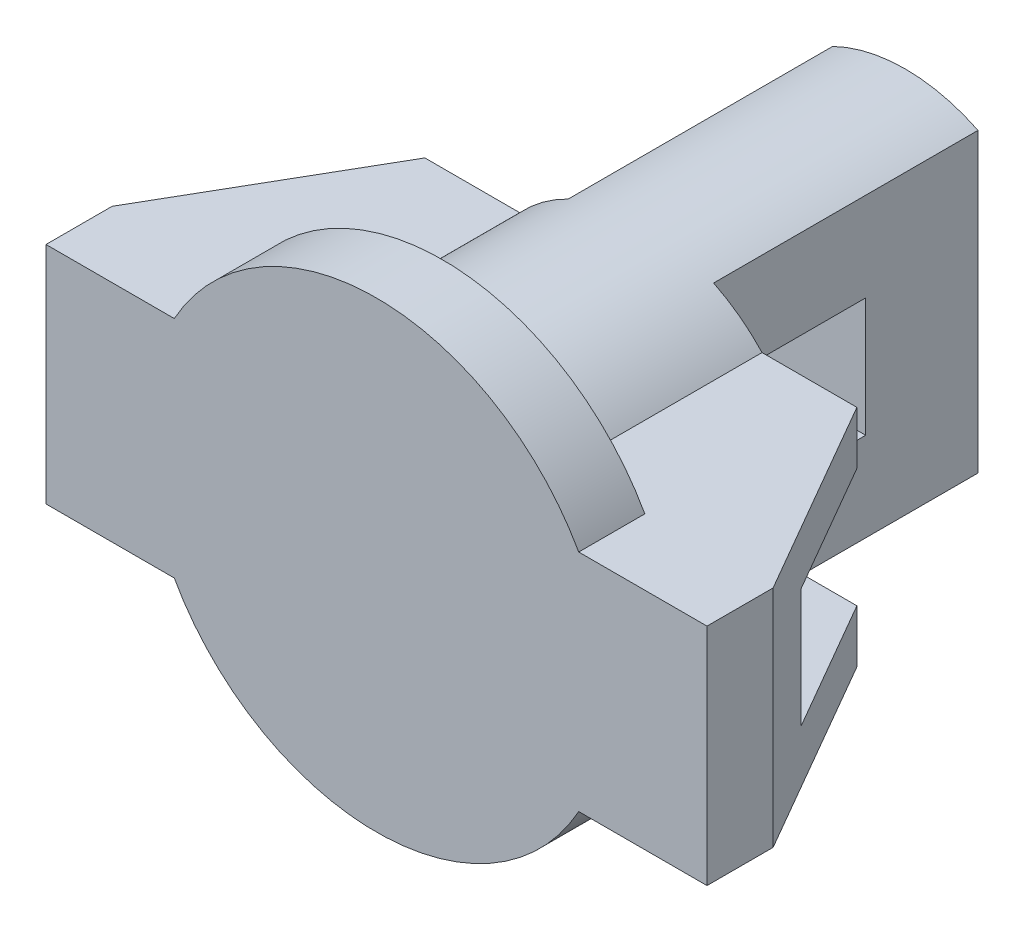
ISO-10303-21;
HEADER;
FILE_DESCRIPTION(('STEP AP214'),'2;1');
FILE_NAME('part.step','',(''),(''),'','','');
FILE_SCHEMA(('AUTOMOTIVE_DESIGN { 1 0 10303 214 1 1 1 1 }'));
ENDSEC;
DATA;
#1=APPLICATION_CONTEXT('core data for automotive mechanical design processes');
#2=APPLICATION_PROTOCOL_DEFINITION('international standard','automotive_design',2000,#1);
#3=PRODUCT_CONTEXT('',#1,'mechanical');
#4=PRODUCT('Part','Part','',(#3));
#5=PRODUCT_RELATED_PRODUCT_CATEGORY('part','',(#4));
#6=PRODUCT_DEFINITION_FORMATION('','',#4);
#7=PRODUCT_DEFINITION_CONTEXT('part definition',#1,'design');
#8=PRODUCT_DEFINITION('design','',#6,#7);
#9=PRODUCT_DEFINITION_SHAPE('','',#8);
#10=(LENGTH_UNIT() NAMED_UNIT(*) SI_UNIT(.MILLI.,.METRE.));
#11=(NAMED_UNIT(*) PLANE_ANGLE_UNIT() SI_UNIT($,.RADIAN.));
#12=(NAMED_UNIT(*) SI_UNIT($,.STERADIAN.) SOLID_ANGLE_UNIT());
#13=UNCERTAINTY_MEASURE_WITH_UNIT(LENGTH_MEASURE(1.E-05),#10,'distance_accuracy_value','');
#14=(GEOMETRIC_REPRESENTATION_CONTEXT(3) GLOBAL_UNCERTAINTY_ASSIGNED_CONTEXT((#13)) GLOBAL_UNIT_ASSIGNED_CONTEXT((#10,
#11,#12)) REPRESENTATION_CONTEXT('',''));
#15=CARTESIAN_POINT('',(0.,0.,0.));
#16=DIRECTION('',(0.,0.,1.));
#17=DIRECTION('',(1.,0.,0.));
#18=AXIS2_PLACEMENT_3D('',#15,#16,#17);
#19=CARTESIAN_POINT('',(-32.6794919243112,34.,-40.));
#20=DIRECTION('',(0.,0.,1.));
#21=DIRECTION('',(1.,0.,0.));
#22=AXIS2_PLACEMENT_3D('',#19,#20,#21);
#23=PLANE('',#22);
#24=DIRECTION('',(0.,1.,0.));
#25=VECTOR('',#24,1.);
#26=CARTESIAN_POINT('',(-11.,0.,-40.));
#27=LINE('',#26,#25);
#28=CARTESIAN_POINT('',(-11.,26.,-40.));
#29=VERTEX_POINT('',#28);
#30=CARTESIAN_POINT('',(-11.,39.4499443206437,-40.));
#31=VERTEX_POINT('',#30);
#32=EDGE_CURVE('E215',#29,#31,#27,.T.);
#33=ORIENTED_EDGE('',*,*,#32,.F.);
#34=DIRECTION('',(-1.,0.,0.));
#35=VECTOR('',#34,1.);
#36=CARTESIAN_POINT('',(-32.6794919243112,26.,-40.));
#37=LINE('',#36,#35);
#38=CARTESIAN_POINT('',(-32.6794919243112,26.,-40.));
#39=VERTEX_POINT('',#38);
#40=EDGE_CURVE('E245',#29,#39,#37,.T.);
#41=ORIENTED_EDGE('',*,*,#40,.T.);
#42=DIRECTION('',(0.,-1.,0.));
#43=VECTOR('',#42,1.);
#44=CARTESIAN_POINT('',(-32.6794919243112,34.,-40.));
#45=LINE('',#44,#43);
#46=CARTESIAN_POINT('',(-32.6794919243112,34.,-40.));
#47=VERTEX_POINT('',#46);
#48=EDGE_CURVE('E347',#47,#39,#45,.T.);
#49=ORIENTED_EDGE('',*,*,#48,.F.);
#50=DIRECTION('',(-1.,0.,0.));
#51=VECTOR('',#50,1.);
#52=CARTESIAN_POINT('',(-32.6794919243112,34.,-40.));
#53=LINE('',#52,#51);
#54=CARTESIAN_POINT('',(-18.3303027798234,34.,-40.));
#55=VERTEX_POINT('',#54);
#56=EDGE_CURVE('E313',#55,#47,#53,.T.);
#57=ORIENTED_EDGE('',*,*,#56,.F.);
#58=CARTESIAN_POINT('',(0.,17.,-40.));
#59=DIRECTION('',(0.,0.,1.));
#60=DIRECTION('',(1.,0.,0.));
#61=AXIS2_PLACEMENT_3D('',#58,#59,#60);
#62=CIRCLE('',#61,25.);
#63=EDGE_CURVE('E374',#55,#31,#62,.F.);
#64=ORIENTED_EDGE('',*,*,#63,.T.);
#65=EDGE_LOOP('',(#33,#41,#49,#57,#64));
#66=FACE_BOUND('',#65,.T.);
#67=ADVANCED_FACE('F33',(#66),#23,.F.);
#68=DIRECTION('',(0.,-1.,0.));
#69=VECTOR('',#68,1.);
#70=CARTESIAN_POINT('',(32.6794919243112,34.,-40.));
#71=LINE('',#70,#69);
#72=CARTESIAN_POINT('',(32.6794919243112,34.,-40.));
#73=VERTEX_POINT('',#72);
#74=CARTESIAN_POINT('',(32.6794919243112,26.,-40.));
#75=VERTEX_POINT('',#74);
#76=EDGE_CURVE('E350',#73,#75,#71,.T.);
#77=ORIENTED_EDGE('',*,*,#76,.T.);
#78=DIRECTION('',(-1.,0.,0.));
#79=VECTOR('',#78,1.);
#80=CARTESIAN_POINT('',(-32.6794919243112,26.,-40.));
#81=LINE('',#80,#79);
#82=CARTESIAN_POINT('',(11.,26.,-40.));
#83=VERTEX_POINT('',#82);
#84=EDGE_CURVE('E238',#75,#83,#81,.T.);
#85=ORIENTED_EDGE('',*,*,#84,.T.);
#86=DIRECTION('',(0.,1.,0.));
#87=VECTOR('',#86,1.);
#88=CARTESIAN_POINT('',(11.,0.,-40.));
#89=LINE('',#88,#87);
#90=CARTESIAN_POINT('',(11.,39.4499443206437,-40.));
#91=VERTEX_POINT('',#90);
#92=EDGE_CURVE('E256',#83,#91,#89,.T.);
#93=ORIENTED_EDGE('',*,*,#92,.T.);
#94=CARTESIAN_POINT('',(0.,17.,-40.));
#95=DIRECTION('',(0.,0.,1.));
#96=DIRECTION('',(1.,0.,0.));
#97=AXIS2_PLACEMENT_3D('',#94,#95,#96);
#98=CIRCLE('',#97,25.);
#99=CARTESIAN_POINT('',(18.3303027798234,34.,-40.));
#100=VERTEX_POINT('',#99);
#101=EDGE_CURVE('E378',#91,#100,#98,.F.);
#102=ORIENTED_EDGE('',*,*,#101,.T.);
#103=EDGE_CURVE('E314',#73,#100,#53,.T.);
#104=ORIENTED_EDGE('',*,*,#103,.F.);
#105=EDGE_LOOP('',(#77,#85,#93,#102,#104));
#106=FACE_BOUND('',#105,.T.);
#107=ADVANCED_FACE('F395',(#106),#23,.F.);
#108=CARTESIAN_POINT('',(0.,17.,-80.));
#109=DIRECTION('',(0.,0.,1.));
#110=DIRECTION('',(1.,0.,0.));
#111=AXIS2_PLACEMENT_3D('',#108,#109,#110);
#112=CYLINDRICAL_SURFACE('',#111,25.);
#113=CARTESIAN_POINT('',(18.3303027798234,0.,-40.));
#114=VERTEX_POINT('',#113);
#115=CARTESIAN_POINT('',(11.,-5.44994432064365,-40.));
#116=VERTEX_POINT('',#115);
#117=EDGE_CURVE('E381',#114,#116,#98,.F.);
#118=ORIENTED_EDGE('',*,*,#117,.F.);
#119=DIRECTION('',(0.,0.,1.));
#120=VECTOR('',#119,1.);
#121=CARTESIAN_POINT('',(18.3303027798234,0.,-80.));
#122=LINE('',#121,#120);
#123=CARTESIAN_POINT('',(18.3303027798234,0.,-9.99999999999999));
#124=VERTEX_POINT('',#123);
#125=EDGE_CURVE('E283',#114,#124,#122,.T.);
#126=ORIENTED_EDGE('',*,*,#125,.T.);
#127=CARTESIAN_POINT('',(0.,17.,-9.99999999999999));
#128=DIRECTION('',(0.,0.,1.));
#129=DIRECTION('',(1.,0.,0.));
#130=AXIS2_PLACEMENT_3D('',#127,#128,#129);
#131=CIRCLE('',#130,25.);
#132=CARTESIAN_POINT('',(-18.3303027798234,0.,-9.99999999999999));
#133=VERTEX_POINT('',#132);
#134=EDGE_CURVE('E285',#133,#124,#131,.T.);
#135=ORIENTED_EDGE('',*,*,#134,.F.);
#136=DIRECTION('',(0.,0.,1.));
#137=VECTOR('',#136,1.);
#138=CARTESIAN_POINT('',(-18.3303027798234,0.,-80.));
#139=LINE('',#138,#137);
#140=CARTESIAN_POINT('',(-18.3303027798234,0.,-40.));
#141=VERTEX_POINT('',#140);
#142=EDGE_CURVE('E280',#133,#141,#139,.F.);
#143=ORIENTED_EDGE('',*,*,#142,.T.);
#144=CARTESIAN_POINT('',(-11.,-5.44994432064365,-40.));
#145=VERTEX_POINT('',#144);
#146=EDGE_CURVE('E377',#145,#141,#62,.F.);
#147=ORIENTED_EDGE('',*,*,#146,.F.);
#148=DIRECTION('',(0.,0.,1.));
#149=VECTOR('',#148,1.);
#150=CARTESIAN_POINT('',(-11.,-5.44994432064365,-80.));
#151=LINE('',#150,#149);
#152=CARTESIAN_POINT('',(-11.,-5.44994432064365,-80.));
#153=VERTEX_POINT('',#152);
#154=EDGE_CURVE('E262',#145,#153,#151,.F.);
#155=ORIENTED_EDGE('',*,*,#154,.T.);
#156=CARTESIAN_POINT('',(0.,17.,-80.));
#157=DIRECTION('',(0.,0.,1.));
#158=DIRECTION('',(1.,0.,0.));
#159=AXIS2_PLACEMENT_3D('',#156,#157,#158);
#160=CIRCLE('',#159,25.);
#161=CARTESIAN_POINT('',(11.,-5.44994432064365,-80.));
#162=VERTEX_POINT('',#161);
#163=EDGE_CURVE('E270',#153,#162,#160,.T.);
#164=ORIENTED_EDGE('',*,*,#163,.T.);
#165=DIRECTION('',(0.,0.,1.));
#166=VECTOR('',#165,1.);
#167=CARTESIAN_POINT('',(11.,-5.44994432064365,-80.));
#168=LINE('',#167,#166);
#169=EDGE_CURVE('E268',#116,#162,#168,.F.);
#170=ORIENTED_EDGE('',*,*,#169,.F.);
#171=EDGE_LOOP('',(#118,#126,#135,#143,#147,#155,#164,#170));
#172=FACE_BOUND('',#171,.T.);
#173=ADVANCED_FACE('F431',(#172),#112,.T.);
#174=ORIENTED_EDGE('',*,*,#101,.F.);
#175=DIRECTION('',(0.,0.,1.));
#176=VECTOR('',#175,1.);
#177=CARTESIAN_POINT('',(11.,39.4499443206437,-80.));
#178=LINE('',#177,#176);
#179=CARTESIAN_POINT('',(11.,39.4499443206437,-80.));
#180=VERTEX_POINT('',#179);
#181=EDGE_CURVE('E265',#180,#91,#178,.T.);
#182=ORIENTED_EDGE('',*,*,#181,.F.);
#183=CARTESIAN_POINT('',(-11.,39.4499443206437,-80.));
#184=VERTEX_POINT('',#183);
#185=EDGE_CURVE('E273',#180,#184,#160,.T.);
#186=ORIENTED_EDGE('',*,*,#185,.T.);
#187=DIRECTION('',(0.,0.,1.));
#188=VECTOR('',#187,1.);
#189=CARTESIAN_POINT('',(-11.,39.4499443206437,-80.));
#190=LINE('',#189,#188);
#191=EDGE_CURVE('E255',#184,#31,#190,.T.);
#192=ORIENTED_EDGE('',*,*,#191,.T.);
#193=ORIENTED_EDGE('',*,*,#63,.F.);
#194=DIRECTION('',(0.,0.,1.));
#195=VECTOR('',#194,1.);
#196=CARTESIAN_POINT('',(-18.3303027798234,34.,-80.));
#197=LINE('',#196,#195);
#198=CARTESIAN_POINT('',(-18.3303027798234,34.,-9.99999999999999));
#199=VERTEX_POINT('',#198);
#200=EDGE_CURVE('E274',#199,#55,#197,.F.);
#201=ORIENTED_EDGE('',*,*,#200,.F.);
#202=CARTESIAN_POINT('',(0.,17.,-9.99999999999999));
#203=DIRECTION('',(0.,0.,1.));
#204=DIRECTION('',(1.,0.,0.));
#205=AXIS2_PLACEMENT_3D('',#202,#203,#204);
#206=CIRCLE('',#205,25.);
#207=CARTESIAN_POINT('',(18.3303027798234,34.,-9.99999999999999));
#208=VERTEX_POINT('',#207);
#209=EDGE_CURVE('E366',#208,#199,#206,.T.);
#210=ORIENTED_EDGE('',*,*,#209,.F.);
#211=DIRECTION('',(0.,0.,1.));
#212=VECTOR('',#211,1.);
#213=CARTESIAN_POINT('',(18.3303027798234,34.,-80.));
#214=LINE('',#213,#212);
#215=EDGE_CURVE('E277',#100,#208,#214,.T.);
#216=ORIENTED_EDGE('',*,*,#215,.F.);
#217=EDGE_LOOP('',(#174,#182,#186,#192,#193,#201,#210,#216));
#218=FACE_BOUND('',#217,.T.);
#219=ADVANCED_FACE('F453',(#218),#112,.T.);
#220=CARTESIAN_POINT('',(0.,17.,-80.));
#221=DIRECTION('',(0.,0.,1.));
#222=DIRECTION('',(1.,0.,0.));
#223=AXIS2_PLACEMENT_3D('',#220,#221,#222);
#224=PLANE('',#223);
#225=ORIENTED_EDGE('',*,*,#185,.F.);
#226=DIRECTION('',(0.,-1.,0.));
#227=VECTOR('',#226,1.);
#228=CARTESIAN_POINT('',(11.,17.,-80.));
#229=LINE('',#228,#227);
#230=EDGE_CURVE('E371',#180,#162,#229,.T.);
#231=ORIENTED_EDGE('',*,*,#230,.T.);
#232=ORIENTED_EDGE('',*,*,#163,.F.);
#233=DIRECTION('',(0.,-1.,0.));
#234=VECTOR('',#233,1.);
#235=CARTESIAN_POINT('',(-11.,17.,-80.));
#236=LINE('',#235,#234);
#237=EDGE_CURVE('E369',#184,#153,#236,.T.);
#238=ORIENTED_EDGE('',*,*,#237,.F.);
#239=EDGE_LOOP('',(#225,#231,#232,#238));
#240=FACE_BOUND('',#239,.T.);
#241=ADVANCED_FACE('F443',(#240),#224,.F.);
#242=CARTESIAN_POINT('',(-32.6794919243112,8.,-40.));
#243=VERTEX_POINT('',#242);
#244=CARTESIAN_POINT('',(-32.6794919243112,0.,-40.));
#245=VERTEX_POINT('',#244);
#246=EDGE_CURVE('E346',#243,#245,#45,.T.);
#247=ORIENTED_EDGE('',*,*,#246,.F.);
#248=DIRECTION('',(1.,0.,0.));
#249=VECTOR('',#248,1.);
#250=CARTESIAN_POINT('',(-32.6794919243112,8.,-40.));
#251=LINE('',#250,#249);
#252=CARTESIAN_POINT('',(-11.,8.,-40.));
#253=VERTEX_POINT('',#252);
#254=EDGE_CURVE('E229',#243,#253,#251,.T.);
#255=ORIENTED_EDGE('',*,*,#254,.T.);
#256=EDGE_CURVE('E257',#145,#253,#27,.T.);
#257=ORIENTED_EDGE('',*,*,#256,.F.);
#258=ORIENTED_EDGE('',*,*,#146,.T.);
#259=DIRECTION('',(-1.,0.,0.));
#260=VECTOR('',#259,1.);
#261=CARTESIAN_POINT('',(-32.6794919243112,0.,-40.));
#262=LINE('',#261,#260);
#263=EDGE_CURVE('E328',#141,#245,#262,.T.);
#264=ORIENTED_EDGE('',*,*,#263,.T.);
#265=EDGE_LOOP('',(#247,#255,#257,#258,#264));
#266=FACE_BOUND('',#265,.T.);
#267=ADVANCED_FACE('F432',(#266),#23,.F.);
#268=CARTESIAN_POINT('',(0.,34.,0.));
#269=DIRECTION('',(0.,-1.,0.));
#270=DIRECTION('',(0.,0.,-1.));
#271=AXIS2_PLACEMENT_3D('',#268,#269,#270);
#272=PLANE('',#271);
#273=ORIENTED_EDGE('',*,*,#103,.T.);
#274=ORIENTED_EDGE('',*,*,#215,.T.);
#275=DIRECTION('',(-1.,0.,0.));
#276=VECTOR('',#275,1.);
#277=CARTESIAN_POINT('',(0.,34.,-10.));
#278=LINE('',#277,#276);
#279=CARTESIAN_POINT('',(30.5941170815567,34.,-10.));
#280=VERTEX_POINT('',#279);
#281=EDGE_CURVE('E297',#280,#208,#278,.T.);
#282=ORIENTED_EDGE('',*,*,#281,.F.);
#283=DIRECTION('',(0.,0.,1.));
#284=VECTOR('',#283,1.);
#285=CARTESIAN_POINT('',(30.5941170815567,34.,-10.));
#286=LINE('',#285,#284);
#287=CARTESIAN_POINT('',(30.5941170815567,34.,0.));
#288=VERTEX_POINT('',#287);
#289=EDGE_CURVE('E303',#280,#288,#286,.T.);
#290=ORIENTED_EDGE('',*,*,#289,.T.);
#291=DIRECTION('',(1.,0.,0.));
#292=VECTOR('',#291,1.);
#293=CARTESIAN_POINT('',(50.,34.,0.));
#294=LINE('',#293,#292);
#295=CARTESIAN_POINT('',(50.,34.,0.));
#296=VERTEX_POINT('',#295);
#297=EDGE_CURVE('E320',#288,#296,#294,.T.);
#298=ORIENTED_EDGE('',*,*,#297,.T.);
#299=DIRECTION('',(0.,0.,-1.));
#300=VECTOR('',#299,1.);
#301=CARTESIAN_POINT('',(50.,34.,-10.));
#302=LINE('',#301,#300);
#303=CARTESIAN_POINT('',(50.,34.,-10.));
#304=VERTEX_POINT('',#303);
#305=EDGE_CURVE('E307',#296,#304,#302,.T.);
#306=ORIENTED_EDGE('',*,*,#305,.T.);
#307=DIRECTION('',(-0.500000000000001,0.,-0.866025403784438));
#308=VECTOR('',#307,1.);
#309=CARTESIAN_POINT('',(32.6794919243112,34.,-40.));
#310=LINE('',#309,#308);
#311=EDGE_CURVE('E310',#304,#73,#310,.T.);
#312=ORIENTED_EDGE('',*,*,#311,.T.);
#313=EDGE_LOOP('',(#273,#274,#282,#290,#298,#306,#312));
#314=FACE_BOUND('',#313,.T.);
#315=ADVANCED_FACE('F442',(#314),#272,.F.);
#316=CARTESIAN_POINT('',(0.,0.,0.));
#317=DIRECTION('',(0.,-1.,0.));
#318=DIRECTION('',(0.,0.,-1.));
#319=AXIS2_PLACEMENT_3D('',#316,#317,#318);
#320=PLANE('',#319);
#321=ORIENTED_EDGE('',*,*,#125,.F.);
#322=CARTESIAN_POINT('',(32.6794919243112,0.,-40.));
#323=VERTEX_POINT('',#322);
#324=EDGE_CURVE('E329',#323,#114,#262,.T.);
#325=ORIENTED_EDGE('',*,*,#324,.F.);
#326=DIRECTION('',(-0.500000000000001,0.,-0.866025403784438));
#327=VECTOR('',#326,1.);
#328=CARTESIAN_POINT('',(32.6794919243112,0.,-40.));
#329=LINE('',#328,#327);
#330=CARTESIAN_POINT('',(50.,0.,-10.));
#331=VERTEX_POINT('',#330);
#332=EDGE_CURVE('E326',#331,#323,#329,.T.);
#333=ORIENTED_EDGE('',*,*,#332,.F.);
#334=DIRECTION('',(0.,0.,-1.));
#335=VECTOR('',#334,1.);
#336=CARTESIAN_POINT('',(50.,0.,-10.));
#337=LINE('',#336,#335);
#338=CARTESIAN_POINT('',(50.,0.,0.));
#339=VERTEX_POINT('',#338);
#340=EDGE_CURVE('E306',#339,#331,#337,.T.);
#341=ORIENTED_EDGE('',*,*,#340,.F.);
#342=DIRECTION('',(1.,0.,0.));
#343=VECTOR('',#342,1.);
#344=CARTESIAN_POINT('',(50.,0.,0.));
#345=LINE('',#344,#343);
#346=CARTESIAN_POINT('',(30.5941170815567,0.,0.));
#347=VERTEX_POINT('',#346);
#348=EDGE_CURVE('E335',#347,#339,#345,.T.);
#349=ORIENTED_EDGE('',*,*,#348,.F.);
#350=DIRECTION('',(0.,0.,1.));
#351=VECTOR('',#350,1.);
#352=CARTESIAN_POINT('',(30.5941170815567,0.,-10.));
#353=LINE('',#352,#351);
#354=CARTESIAN_POINT('',(30.5941170815567,0.,-10.));
#355=VERTEX_POINT('',#354);
#356=EDGE_CURVE('E363',#355,#347,#353,.T.);
#357=ORIENTED_EDGE('',*,*,#356,.F.);
#358=DIRECTION('',(-1.,0.,0.));
#359=VECTOR('',#358,1.);
#360=CARTESIAN_POINT('',(0.,0.,-10.));
#361=LINE('',#360,#359);
#362=EDGE_CURVE('E357',#355,#124,#361,.T.);
#363=ORIENTED_EDGE('',*,*,#362,.T.);
#364=EDGE_LOOP('',(#321,#325,#333,#341,#349,#357,#363));
#365=FACE_BOUND('',#364,.T.);
#366=ADVANCED_FACE('F449',(#365),#320,.T.);
#367=CARTESIAN_POINT('',(50.,34.,-10.));
#368=DIRECTION('',(-1.,0.,0.));
#369=DIRECTION('',(0.,0.,1.));
#370=AXIS2_PLACEMENT_3D('',#367,#368,#369);
#371=PLANE('',#370);
#372=ORIENTED_EDGE('',*,*,#340,.T.);
#373=DIRECTION('',(0.,-1.,0.));
#374=VECTOR('',#373,1.);
#375=CARTESIAN_POINT('',(50.,34.,-10.));
#376=LINE('',#375,#374);
#377=EDGE_CURVE('E353',#304,#331,#376,.T.);
#378=ORIENTED_EDGE('',*,*,#377,.F.);
#379=ORIENTED_EDGE('',*,*,#305,.F.);
#380=DIRECTION('',(0.,-1.,0.));
#381=VECTOR('',#380,1.);
#382=CARTESIAN_POINT('',(50.,34.,0.));
#383=LINE('',#382,#381);
#384=EDGE_CURVE('E323',#296,#339,#383,.T.);
#385=ORIENTED_EDGE('',*,*,#384,.T.);
#386=EDGE_LOOP('',(#372,#378,#379,#385));
#387=FACE_BOUND('',#386,.T.);
#388=ADVANCED_FACE('F35',(#387),#371,.F.);
#389=CARTESIAN_POINT('',(32.6794919243112,34.,-40.));
#390=DIRECTION('',(-0.866025403784438,0.,0.500000000000001));
#391=DIRECTION('',(0.500000000000001,0.,0.866025403784438));
#392=AXIS2_PLACEMENT_3D('',#389,#390,#391);
#393=PLANE('',#392);
#394=DIRECTION('',(0.,1.,0.));
#395=VECTOR('',#394,1.);
#396=CARTESIAN_POINT('',(44.2264973081037,34.,-20.));
#397=LINE('',#396,#395);
#398=CARTESIAN_POINT('',(44.2264973081037,8.,-20.));
#399=VERTEX_POINT('',#398);
#400=CARTESIAN_POINT('',(44.2264973081037,26.,-20.));
#401=VERTEX_POINT('',#400);
#402=EDGE_CURVE('E206',#399,#401,#397,.T.);
#403=ORIENTED_EDGE('',*,*,#402,.T.);
#404=DIRECTION('',(-0.500000000000001,0.,-0.866025403784438));
#405=VECTOR('',#404,1.);
#406=CARTESIAN_POINT('',(32.6794919243112,26.,-40.));
#407=LINE('',#406,#405);
#408=EDGE_CURVE('E241',#401,#75,#407,.T.);
#409=ORIENTED_EDGE('',*,*,#408,.T.);
#410=ORIENTED_EDGE('',*,*,#76,.F.);
#411=ORIENTED_EDGE('',*,*,#311,.F.);
#412=ORIENTED_EDGE('',*,*,#377,.T.);
#413=ORIENTED_EDGE('',*,*,#332,.T.);
#414=CARTESIAN_POINT('',(32.6794919243112,8.,-40.));
#415=VERTEX_POINT('',#414);
#416=EDGE_CURVE('E226',#415,#323,#71,.T.);
#417=ORIENTED_EDGE('',*,*,#416,.F.);
#418=DIRECTION('',(0.500000000000001,0.,0.866025403784438));
#419=VECTOR('',#418,1.);
#420=CARTESIAN_POINT('',(32.6794919243112,8.,-40.));
#421=LINE('',#420,#419);
#422=EDGE_CURVE('E219',#415,#399,#421,.T.);
#423=ORIENTED_EDGE('',*,*,#422,.T.);
#424=EDGE_LOOP('',(#403,#409,#410,#411,#412,#413,#417,#423));
#425=FACE_BOUND('',#424,.T.);
#426=ADVANCED_FACE('F224',(#425),#393,.F.);
#427=CARTESIAN_POINT('',(11.,8.,-40.));
#428=VERTEX_POINT('',#427);
#429=EDGE_CURVE('E252',#116,#428,#89,.T.);
#430=ORIENTED_EDGE('',*,*,#429,.T.);
#431=DIRECTION('',(1.,0.,0.));
#432=VECTOR('',#431,1.);
#433=CARTESIAN_POINT('',(-32.6794919243112,8.,-40.));
#434=LINE('',#433,#432);
#435=EDGE_CURVE('E54',#428,#415,#434,.T.);
#436=ORIENTED_EDGE('',*,*,#435,.T.);
#437=ORIENTED_EDGE('',*,*,#416,.T.);
#438=ORIENTED_EDGE('',*,*,#324,.T.);
#439=ORIENTED_EDGE('',*,*,#117,.T.);
#440=EDGE_LOOP('',(#430,#436,#437,#438,#439));
#441=FACE_BOUND('',#440,.T.);
#442=ADVANCED_FACE('F427',(#441),#23,.F.);
#443=CARTESIAN_POINT('',(-50.,34.,-9.99999999999999));
#444=DIRECTION('',(0.866025403784438,0.,0.500000000000001));
#445=DIRECTION('',(0.500000000000001,0.,-0.866025403784438));
#446=AXIS2_PLACEMENT_3D('',#443,#444,#445);
#447=PLANE('',#446);
#448=ORIENTED_EDGE('',*,*,#48,.T.);
#449=DIRECTION('',(-0.500000000000001,0.,0.866025403784438));
#450=VECTOR('',#449,1.);
#451=CARTESIAN_POINT('',(-50.,26.,-9.99999999999999));
#452=LINE('',#451,#450);
#453=CARTESIAN_POINT('',(-44.2264973081037,26.,-20.));
#454=VERTEX_POINT('',#453);
#455=EDGE_CURVE('E248',#39,#454,#452,.T.);
#456=ORIENTED_EDGE('',*,*,#455,.T.);
#457=DIRECTION('',(0.,-1.,0.));
#458=VECTOR('',#457,1.);
#459=CARTESIAN_POINT('',(-44.2264973081037,34.,-20.));
#460=LINE('',#459,#458);
#461=CARTESIAN_POINT('',(-44.2264973081037,8.,-20.));
#462=VERTEX_POINT('',#461);
#463=EDGE_CURVE('E11',#454,#462,#460,.T.);
#464=ORIENTED_EDGE('',*,*,#463,.T.);
#465=DIRECTION('',(0.500000000000001,0.,-0.866025403784438));
#466=VECTOR('',#465,1.);
#467=CARTESIAN_POINT('',(-50.,8.,-9.99999999999999));
#468=LINE('',#467,#466);
#469=EDGE_CURVE('E221',#462,#243,#468,.T.);
#470=ORIENTED_EDGE('',*,*,#469,.T.);
#471=ORIENTED_EDGE('',*,*,#246,.T.);
#472=DIRECTION('',(-0.500000000000001,0.,0.866025403784438));
#473=VECTOR('',#472,1.);
#474=CARTESIAN_POINT('',(-50.,0.,-9.99999999999999));
#475=LINE('',#474,#473);
#476=CARTESIAN_POINT('',(-50.,0.,-9.99999999999999));
#477=VERTEX_POINT('',#476);
#478=EDGE_CURVE('E331',#245,#477,#475,.T.);
#479=ORIENTED_EDGE('',*,*,#478,.T.);
#480=DIRECTION('',(0.,-1.,0.));
#481=VECTOR('',#480,1.);
#482=CARTESIAN_POINT('',(-50.,34.,-9.99999999999999));
#483=LINE('',#482,#481);
#484=CARTESIAN_POINT('',(-50.,34.,-9.99999999999999));
#485=VERTEX_POINT('',#484);
#486=EDGE_CURVE('E343',#485,#477,#483,.T.);
#487=ORIENTED_EDGE('',*,*,#486,.F.);
#488=DIRECTION('',(-0.500000000000001,0.,0.866025403784438));
#489=VECTOR('',#488,1.);
#490=CARTESIAN_POINT('',(-50.,34.,-9.99999999999999));
#491=LINE('',#490,#489);
#492=EDGE_CURVE('E316',#47,#485,#491,.T.);
#493=ORIENTED_EDGE('',*,*,#492,.F.);
#494=EDGE_LOOP('',(#448,#456,#464,#470,#471,#479,#487,#493));
#495=FACE_BOUND('',#494,.T.);
#496=ADVANCED_FACE('F400',(#495),#447,.F.);
#497=CARTESIAN_POINT('',(-50.,34.,0.));
#498=DIRECTION('',(1.,0.,0.));
#499=DIRECTION('',(0.,0.,-1.));
#500=AXIS2_PLACEMENT_3D('',#497,#498,#499);
#501=PLANE('',#500);
#502=DIRECTION('',(0.,0.,1.));
#503=VECTOR('',#502,1.);
#504=CARTESIAN_POINT('',(-50.,0.,0.));
#505=LINE('',#504,#503);
#506=CARTESIAN_POINT('',(-50.,0.,0.));
#507=VERTEX_POINT('',#506);
#508=EDGE_CURVE('E333',#477,#507,#505,.T.);
#509=ORIENTED_EDGE('',*,*,#508,.T.);
#510=DIRECTION('',(0.,-1.,0.));
#511=VECTOR('',#510,1.);
#512=CARTESIAN_POINT('',(-50.,34.,0.));
#513=LINE('',#512,#511);
#514=CARTESIAN_POINT('',(-50.,34.,0.));
#515=VERTEX_POINT('',#514);
#516=EDGE_CURVE('E340',#515,#507,#513,.T.);
#517=ORIENTED_EDGE('',*,*,#516,.F.);
#518=DIRECTION('',(0.,0.,1.));
#519=VECTOR('',#518,1.);
#520=CARTESIAN_POINT('',(-50.,34.,0.));
#521=LINE('',#520,#519);
#522=EDGE_CURVE('E318',#485,#515,#521,.T.);
#523=ORIENTED_EDGE('',*,*,#522,.F.);
#524=ORIENTED_EDGE('',*,*,#486,.T.);
#525=EDGE_LOOP('',(#509,#517,#523,#524));
#526=FACE_BOUND('',#525,.T.);
#527=ADVANCED_FACE('F440',(#526),#501,.F.);
#528=CARTESIAN_POINT('',(50.,34.,0.));
#529=DIRECTION('',(0.,0.,-1.));
#530=DIRECTION('',(-1.,0.,0.));
#531=AXIS2_PLACEMENT_3D('',#528,#529,#530);
#532=PLANE('',#531);
#533=CARTESIAN_POINT('',(-30.5941170815567,0.,0.));
#534=VERTEX_POINT('',#533);
#535=EDGE_CURVE('E311',#507,#534,#345,.T.);
#536=ORIENTED_EDGE('',*,*,#535,.T.);
#537=CARTESIAN_POINT('',(0.,17.,0.));
#538=DIRECTION('',(0.,0.,1.));
#539=DIRECTION('',(1.,0.,0.));
#540=AXIS2_PLACEMENT_3D('',#537,#538,#539);
#541=CIRCLE('',#540,35.);
#542=EDGE_CURVE('E288',#534,#347,#541,.T.);
#543=ORIENTED_EDGE('',*,*,#542,.T.);
#544=ORIENTED_EDGE('',*,*,#348,.T.);
#545=ORIENTED_EDGE('',*,*,#384,.F.);
#546=ORIENTED_EDGE('',*,*,#297,.F.);
#547=CARTESIAN_POINT('',(-30.5941170815567,34.,0.));
#548=VERTEX_POINT('',#547);
#549=EDGE_CURVE('E294',#288,#548,#541,.T.);
#550=ORIENTED_EDGE('',*,*,#549,.T.);
#551=EDGE_CURVE('E321',#515,#548,#294,.T.);
#552=ORIENTED_EDGE('',*,*,#551,.F.);
#553=ORIENTED_EDGE('',*,*,#516,.T.);
#554=EDGE_LOOP('',(#536,#543,#544,#545,#546,#550,#552,#553));
#555=FACE_BOUND('',#554,.T.);
#556=ADVANCED_FACE('F471',(#555),#532,.F.);
#557=CARTESIAN_POINT('',(-30.5941170815567,34.,-10.));
#558=VERTEX_POINT('',#557);
#559=EDGE_CURVE('E292',#199,#558,#278,.T.);
#560=ORIENTED_EDGE('',*,*,#559,.F.);
#561=ORIENTED_EDGE('',*,*,#200,.T.);
#562=ORIENTED_EDGE('',*,*,#56,.T.);
#563=ORIENTED_EDGE('',*,*,#492,.T.);
#564=ORIENTED_EDGE('',*,*,#522,.T.);
#565=ORIENTED_EDGE('',*,*,#551,.T.);
#566=DIRECTION('',(0.,0.,1.));
#567=VECTOR('',#566,1.);
#568=CARTESIAN_POINT('',(-30.5941170815567,34.,-10.));
#569=LINE('',#568,#567);
#570=EDGE_CURVE('E300',#548,#558,#569,.F.);
#571=ORIENTED_EDGE('',*,*,#570,.T.);
#572=EDGE_LOOP('',(#560,#561,#562,#563,#564,#565,#571));
#573=FACE_BOUND('',#572,.T.);
#574=ADVANCED_FACE('F452',(#573),#272,.F.);
#575=ORIENTED_EDGE('',*,*,#142,.F.);
#576=CARTESIAN_POINT('',(-30.5941170815567,0.,-10.));
#577=VERTEX_POINT('',#576);
#578=EDGE_CURVE('E356',#133,#577,#361,.T.);
#579=ORIENTED_EDGE('',*,*,#578,.T.);
#580=DIRECTION('',(0.,0.,1.));
#581=VECTOR('',#580,1.);
#582=CARTESIAN_POINT('',(-30.5941170815567,0.,-10.));
#583=LINE('',#582,#581);
#584=EDGE_CURVE('E360',#534,#577,#583,.F.);
#585=ORIENTED_EDGE('',*,*,#584,.F.);
#586=ORIENTED_EDGE('',*,*,#535,.F.);
#587=ORIENTED_EDGE('',*,*,#508,.F.);
#588=ORIENTED_EDGE('',*,*,#478,.F.);
#589=ORIENTED_EDGE('',*,*,#263,.F.);
#590=EDGE_LOOP('',(#575,#579,#585,#586,#587,#588,#589));
#591=FACE_BOUND('',#590,.T.);
#592=ADVANCED_FACE('F468',(#591),#320,.T.);
#593=CARTESIAN_POINT('',(0.,17.,-10.));
#594=DIRECTION('',(0.,0.,1.));
#595=DIRECTION('',(1.,0.,0.));
#596=AXIS2_PLACEMENT_3D('',#593,#594,#595);
#597=PLANE('',#596);
#598=ORIENTED_EDGE('',*,*,#578,.F.);
#599=ORIENTED_EDGE('',*,*,#134,.T.);
#600=ORIENTED_EDGE('',*,*,#362,.F.);
#601=CARTESIAN_POINT('',(0.,17.,-10.));
#602=DIRECTION('',(0.,0.,1.));
#603=DIRECTION('',(1.,0.,0.));
#604=AXIS2_PLACEMENT_3D('',#601,#602,#603);
#605=CIRCLE('',#604,35.);
#606=EDGE_CURVE('E293',#577,#355,#605,.T.);
#607=ORIENTED_EDGE('',*,*,#606,.F.);
#608=EDGE_LOOP('',(#598,#599,#600,#607));
#609=FACE_BOUND('',#608,.T.);
#610=ADVANCED_FACE('F498',(#609),#597,.F.);
#611=CARTESIAN_POINT('',(0.,17.,-10.));
#612=DIRECTION('',(0.,0.,1.));
#613=DIRECTION('',(1.,0.,0.));
#614=AXIS2_PLACEMENT_3D('',#611,#612,#613);
#615=CYLINDRICAL_SURFACE('',#614,35.);
#616=ORIENTED_EDGE('',*,*,#606,.T.);
#617=ORIENTED_EDGE('',*,*,#356,.T.);
#618=ORIENTED_EDGE('',*,*,#542,.F.);
#619=ORIENTED_EDGE('',*,*,#584,.T.);
#620=EDGE_LOOP('',(#616,#617,#618,#619));
#621=FACE_BOUND('',#620,.T.);
#622=ADVANCED_FACE('F502',(#621),#615,.T.);
#623=ORIENTED_EDGE('',*,*,#289,.F.);
#624=EDGE_CURVE('E289',#280,#558,#605,.T.);
#625=ORIENTED_EDGE('',*,*,#624,.T.);
#626=ORIENTED_EDGE('',*,*,#570,.F.);
#627=ORIENTED_EDGE('',*,*,#549,.F.);
#628=EDGE_LOOP('',(#623,#625,#626,#627));
#629=FACE_BOUND('',#628,.T.);
#630=ADVANCED_FACE('F479',(#629),#615,.T.);
#631=ORIENTED_EDGE('',*,*,#281,.T.);
#632=ORIENTED_EDGE('',*,*,#209,.T.);
#633=ORIENTED_EDGE('',*,*,#559,.T.);
#634=ORIENTED_EDGE('',*,*,#624,.F.);
#635=EDGE_LOOP('',(#631,#632,#633,#634));
#636=FACE_BOUND('',#635,.T.);
#637=ADVANCED_FACE('F482',(#636),#597,.F.);
#638=CARTESIAN_POINT('',(-11.,0.,31.386273190299));
#639=DIRECTION('',(-1.,0.,0.));
#640=DIRECTION('',(0.,0.,1.));
#641=AXIS2_PLACEMENT_3D('',#638,#639,#640);
#642=PLANE('',#641);
#643=DIRECTION('',(0.,0.,-1.));
#644=VECTOR('',#643,1.);
#645=CARTESIAN_POINT('',(-11.,26.,31.386273190299));
#646=LINE('',#645,#644);
#647=CARTESIAN_POINT('',(-11.,26.,-63.));
#648=VERTEX_POINT('',#647);
#649=EDGE_CURVE('E243',#29,#648,#646,.T.);
#650=ORIENTED_EDGE('',*,*,#649,.F.);
#651=ORIENTED_EDGE('',*,*,#32,.T.);
#652=ORIENTED_EDGE('',*,*,#191,.F.);
#653=ORIENTED_EDGE('',*,*,#237,.T.);
#654=ORIENTED_EDGE('',*,*,#154,.F.);
#655=ORIENTED_EDGE('',*,*,#256,.T.);
#656=DIRECTION('',(0.,0.,1.));
#657=VECTOR('',#656,1.);
#658=CARTESIAN_POINT('',(-11.,8.,31.386273190299));
#659=LINE('',#658,#657);
#660=CARTESIAN_POINT('',(-11.,8.,-63.));
#661=VERTEX_POINT('',#660);
#662=EDGE_CURVE('E227',#661,#253,#659,.T.);
#663=ORIENTED_EDGE('',*,*,#662,.F.);
#664=DIRECTION('',(0.,-1.,0.));
#665=VECTOR('',#664,1.);
#666=CARTESIAN_POINT('',(-11.,0.,-63.));
#667=LINE('',#666,#665);
#668=EDGE_CURVE('E216',#648,#661,#667,.T.);
#669=ORIENTED_EDGE('',*,*,#668,.F.);
#670=EDGE_LOOP('',(#650,#651,#652,#653,#654,#655,#663,#669));
#671=FACE_BOUND('',#670,.T.);
#672=ADVANCED_FACE('F410',(#671),#642,.T.);
#673=CARTESIAN_POINT('',(11.,0.,31.386273190299));
#674=DIRECTION('',(-1.,0.,0.));
#675=DIRECTION('',(0.,0.,1.));
#676=AXIS2_PLACEMENT_3D('',#673,#674,#675);
#677=PLANE('',#676);
#678=ORIENTED_EDGE('',*,*,#92,.F.);
#679=DIRECTION('',(0.,0.,-1.));
#680=VECTOR('',#679,1.);
#681=CARTESIAN_POINT('',(11.,26.,31.386273190299));
#682=LINE('',#681,#680);
#683=CARTESIAN_POINT('',(11.,26.,-63.));
#684=VERTEX_POINT('',#683);
#685=EDGE_CURVE('E41',#83,#684,#682,.T.);
#686=ORIENTED_EDGE('',*,*,#685,.T.);
#687=DIRECTION('',(0.,-1.,0.));
#688=VECTOR('',#687,1.);
#689=CARTESIAN_POINT('',(11.,0.,-63.));
#690=LINE('',#689,#688);
#691=CARTESIAN_POINT('',(11.,8.,-63.));
#692=VERTEX_POINT('',#691);
#693=EDGE_CURVE('E384',#684,#692,#690,.T.);
#694=ORIENTED_EDGE('',*,*,#693,.T.);
#695=DIRECTION('',(0.,0.,1.));
#696=VECTOR('',#695,1.);
#697=CARTESIAN_POINT('',(11.,8.,31.386273190299));
#698=LINE('',#697,#696);
#699=EDGE_CURVE('E382',#692,#428,#698,.T.);
#700=ORIENTED_EDGE('',*,*,#699,.T.);
#701=ORIENTED_EDGE('',*,*,#429,.F.);
#702=ORIENTED_EDGE('',*,*,#169,.T.);
#703=ORIENTED_EDGE('',*,*,#230,.F.);
#704=ORIENTED_EDGE('',*,*,#181,.T.);
#705=EDGE_LOOP('',(#678,#686,#694,#700,#701,#702,#703,#704));
#706=FACE_BOUND('',#705,.T.);
#707=ADVANCED_FACE('F389',(#706),#677,.F.);
#708=CARTESIAN_POINT('',(50.,8.,-20.));
#709=DIRECTION('',(0.,0.,1.));
#710=DIRECTION('',(1.,0.,0.));
#711=AXIS2_PLACEMENT_3D('',#708,#709,#710);
#712=PLANE('',#711);
#713=DIRECTION('',(-1.,0.,0.));
#714=VECTOR('',#713,1.);
#715=CARTESIAN_POINT('',(50.,8.,-20.));
#716=LINE('',#715,#714);
#717=EDGE_CURVE('E209',#399,#462,#716,.T.);
#718=ORIENTED_EDGE('',*,*,#717,.T.);
#719=ORIENTED_EDGE('',*,*,#463,.F.);
#720=DIRECTION('',(-1.,0.,0.));
#721=VECTOR('',#720,1.);
#722=CARTESIAN_POINT('',(50.,26.,-20.));
#723=LINE('',#722,#721);
#724=EDGE_CURVE('E211',#401,#454,#723,.T.);
#725=ORIENTED_EDGE('',*,*,#724,.F.);
#726=ORIENTED_EDGE('',*,*,#402,.F.);
#727=EDGE_LOOP('',(#718,#719,#725,#726));
#728=FACE_BOUND('',#727,.T.);
#729=ADVANCED_FACE('F208',(#728),#712,.F.);
#730=CARTESIAN_POINT('',(50.,8.,-63.));
#731=DIRECTION('',(0.,0.,-1.));
#732=DIRECTION('',(-1.,0.,0.));
#733=AXIS2_PLACEMENT_3D('',#730,#731,#732);
#734=PLANE('',#733);
#735=ORIENTED_EDGE('',*,*,#668,.T.);
#736=DIRECTION('',(-1.,0.,0.));
#737=VECTOR('',#736,1.);
#738=CARTESIAN_POINT('',(50.,8.,-63.));
#739=LINE('',#738,#737);
#740=EDGE_CURVE('E48',#692,#661,#739,.T.);
#741=ORIENTED_EDGE('',*,*,#740,.F.);
#742=ORIENTED_EDGE('',*,*,#693,.F.);
#743=DIRECTION('',(-1.,0.,0.));
#744=VECTOR('',#743,1.);
#745=CARTESIAN_POINT('',(50.,26.,-63.));
#746=LINE('',#745,#744);
#747=EDGE_CURVE('E231',#684,#648,#746,.T.);
#748=ORIENTED_EDGE('',*,*,#747,.T.);
#749=EDGE_LOOP('',(#735,#741,#742,#748));
#750=FACE_BOUND('',#749,.T.);
#751=ADVANCED_FACE('F413',(#750),#734,.F.);
#752=CARTESIAN_POINT('',(50.,26.,-63.));
#753=DIRECTION('',(0.,1.,0.));
#754=DIRECTION('',(0.,0.,1.));
#755=AXIS2_PLACEMENT_3D('',#752,#753,#754);
#756=PLANE('',#755);
#757=ORIENTED_EDGE('',*,*,#40,.F.);
#758=ORIENTED_EDGE('',*,*,#649,.T.);
#759=ORIENTED_EDGE('',*,*,#747,.F.);
#760=ORIENTED_EDGE('',*,*,#685,.F.);
#761=ORIENTED_EDGE('',*,*,#84,.F.);
#762=ORIENTED_EDGE('',*,*,#408,.F.);
#763=ORIENTED_EDGE('',*,*,#724,.T.);
#764=ORIENTED_EDGE('',*,*,#455,.F.);
#765=EDGE_LOOP('',(#757,#758,#759,#760,#761,#762,#763,#764));
#766=FACE_BOUND('',#765,.T.);
#767=ADVANCED_FACE('F392',(#766),#756,.F.);
#768=CARTESIAN_POINT('',(50.,8.,-63.));
#769=DIRECTION('',(0.,-1.,0.));
#770=DIRECTION('',(0.,0.,-1.));
#771=AXIS2_PLACEMENT_3D('',#768,#769,#770);
#772=PLANE('',#771);
#773=ORIENTED_EDGE('',*,*,#717,.F.);
#774=ORIENTED_EDGE('',*,*,#422,.F.);
#775=ORIENTED_EDGE('',*,*,#435,.F.);
#776=ORIENTED_EDGE('',*,*,#699,.F.);
#777=ORIENTED_EDGE('',*,*,#740,.T.);
#778=ORIENTED_EDGE('',*,*,#662,.T.);
#779=ORIENTED_EDGE('',*,*,#254,.F.);
#780=ORIENTED_EDGE('',*,*,#469,.F.);
#781=EDGE_LOOP('',(#773,#774,#775,#776,#777,#778,#779,#780));
#782=FACE_BOUND('',#781,.T.);
#783=ADVANCED_FACE('F218',(#782),#772,.F.);
#784=CLOSED_SHELL('',(#67,#107,#173,#219,#241,#267,#315,#366,#388,#426,#442,#496,#527,#556,#574,
#592,#610,#622,#630,#637,#672,#707,#729,#751,#767,#783));
#785=MANIFOLD_SOLID_BREP('B2',#784);
#786=ADVANCED_BREP_SHAPE_REPRESENTATION('',(#18,#785),#14);
#787=SHAPE_DEFINITION_REPRESENTATION(#9,#786);
ENDSEC;
END-ISO-10303-21;
